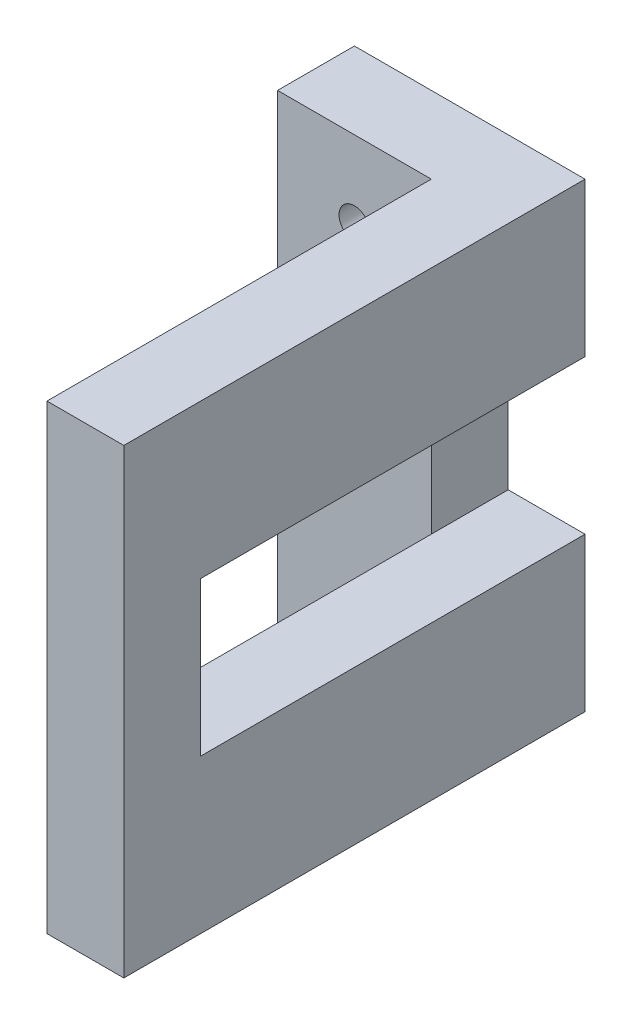
ISO-10303-21;
HEADER;
FILE_DESCRIPTION(('STEP AP214'),'2;1');
FILE_NAME('part.step','',(''),(''),'','','');
FILE_SCHEMA(('AUTOMOTIVE_DESIGN { 1 0 10303 214 1 1 1 1 }'));
ENDSEC;
DATA;
#1=APPLICATION_CONTEXT('core data for automotive mechanical design processes');
#2=APPLICATION_PROTOCOL_DEFINITION('international standard','automotive_design',2000,#1);
#3=PRODUCT_CONTEXT('',#1,'mechanical');
#4=PRODUCT('Part','Part','',(#3));
#5=PRODUCT_RELATED_PRODUCT_CATEGORY('part','',(#4));
#6=PRODUCT_DEFINITION_FORMATION('','',#4);
#7=PRODUCT_DEFINITION_CONTEXT('part definition',#1,'design');
#8=PRODUCT_DEFINITION('design','',#6,#7);
#9=PRODUCT_DEFINITION_SHAPE('','',#8);
#10=(LENGTH_UNIT() NAMED_UNIT(*) SI_UNIT(.MILLI.,.METRE.));
#11=(NAMED_UNIT(*) PLANE_ANGLE_UNIT() SI_UNIT($,.RADIAN.));
#12=(NAMED_UNIT(*) SI_UNIT($,.STERADIAN.) SOLID_ANGLE_UNIT());
#13=UNCERTAINTY_MEASURE_WITH_UNIT(LENGTH_MEASURE(1.E-05),#10,'distance_accuracy_value','');
#14=(GEOMETRIC_REPRESENTATION_CONTEXT(3) GLOBAL_UNCERTAINTY_ASSIGNED_CONTEXT((#13)) GLOBAL_UNIT_ASSIGNED_CONTEXT((#10,
#11,#12)) REPRESENTATION_CONTEXT('',''));
#15=CARTESIAN_POINT('',(0.,0.,0.));
#16=DIRECTION('',(0.,0.,1.));
#17=DIRECTION('',(1.,0.,0.));
#18=AXIS2_PLACEMENT_3D('',#15,#16,#17);
#19=CARTESIAN_POINT('',(3.0701754385965,32.280701754386,10.));
#20=DIRECTION('',(1.,0.,0.));
#21=DIRECTION('',(0.,1.,0.));
#22=AXIS2_PLACEMENT_3D('',#19,#20,#21);
#23=PLANE('',#22);
#24=DIRECTION('',(0.,-1.,0.));
#25=VECTOR('',#24,1.);
#26=CARTESIAN_POINT('',(3.0701754385965,32.280701754386,0.));
#27=LINE('',#26,#25);
#28=CARTESIAN_POINT('',(3.0701754385965,32.280701754386,0.));
#29=VERTEX_POINT('',#28);
#30=CARTESIAN_POINT('',(3.07017543859651,-27.719298245614,0.));
#31=VERTEX_POINT('',#30);
#32=EDGE_CURVE('E176',#29,#31,#27,.T.);
#33=ORIENTED_EDGE('',*,*,#32,.T.);
#34=DIRECTION('',(0.,0.,-1.));
#35=VECTOR('',#34,1.);
#36=CARTESIAN_POINT('',(3.07017543859651,-27.719298245614,10.));
#37=LINE('',#36,#35);
#38=CARTESIAN_POINT('',(3.07017543859651,-27.719298245614,10.));
#39=VERTEX_POINT('',#38);
#40=EDGE_CURVE('E11',#39,#31,#37,.T.);
#41=ORIENTED_EDGE('',*,*,#40,.F.);
#42=DIRECTION('',(0.,-1.,0.));
#43=VECTOR('',#42,1.);
#44=CARTESIAN_POINT('',(3.0701754385965,32.280701754386,10.));
#45=LINE('',#44,#43);
#46=CARTESIAN_POINT('',(3.0701754385965,32.280701754386,10.));
#47=VERTEX_POINT('',#46);
#48=EDGE_CURVE('E177',#47,#39,#45,.T.);
#49=ORIENTED_EDGE('',*,*,#48,.F.);
#50=DIRECTION('',(0.,0.,-1.));
#51=VECTOR('',#50,1.);
#52=CARTESIAN_POINT('',(3.0701754385965,32.280701754386,10.));
#53=LINE('',#52,#51);
#54=EDGE_CURVE('E186',#47,#29,#53,.T.);
#55=ORIENTED_EDGE('',*,*,#54,.T.);
#56=EDGE_LOOP('',(#33,#41,#49,#55));
#57=FACE_BOUND('',#56,.T.);
#58=ADVANCED_FACE('F37',(#57),#23,.F.);
#59=CARTESIAN_POINT('',(3.07017543859651,-27.719298245614,10.));
#60=DIRECTION('',(0.,1.,0.));
#61=DIRECTION('',(0.,0.,1.));
#62=AXIS2_PLACEMENT_3D('',#59,#60,#61);
#63=PLANE('',#62);
#64=DIRECTION('',(1.,0.,0.));
#65=VECTOR('',#64,1.);
#66=CARTESIAN_POINT('',(3.07017543859651,-27.719298245614,0.));
#67=LINE('',#66,#65);
#68=CARTESIAN_POINT('',(33.0701754385965,-27.719298245614,0.));
#69=VERTEX_POINT('',#68);
#70=EDGE_CURVE('E189',#31,#69,#67,.T.);
#71=ORIENTED_EDGE('',*,*,#70,.T.);
#72=DIRECTION('',(0.,0.,-1.));
#73=VECTOR('',#72,1.);
#74=CARTESIAN_POINT('',(33.0701754385965,-27.719298245614,10.));
#75=LINE('',#74,#73);
#76=CARTESIAN_POINT('',(33.0701754385965,-27.719298245614,60.));
#77=VERTEX_POINT('',#76);
#78=EDGE_CURVE('E45',#77,#69,#75,.T.);
#79=ORIENTED_EDGE('',*,*,#78,.F.);
#80=DIRECTION('',(1.,0.,0.));
#81=VECTOR('',#80,1.);
#82=CARTESIAN_POINT('',(33.0701754385965,-27.719298245614,60.));
#83=LINE('',#82,#81);
#84=CARTESIAN_POINT('',(23.0701754385965,-27.719298245614,60.));
#85=VERTEX_POINT('',#84);
#86=EDGE_CURVE('E163',#85,#77,#83,.T.);
#87=ORIENTED_EDGE('',*,*,#86,.F.);
#88=DIRECTION('',(0.,0.,-1.));
#89=VECTOR('',#88,1.);
#90=CARTESIAN_POINT('',(23.0701754385965,-27.719298245614,60.));
#91=LINE('',#90,#89);
#92=CARTESIAN_POINT('',(23.0701754385965,-27.719298245614,10.));
#93=VERTEX_POINT('',#92);
#94=EDGE_CURVE('E166',#85,#93,#91,.T.);
#95=ORIENTED_EDGE('',*,*,#94,.T.);
#96=DIRECTION('',(1.,0.,0.));
#97=VECTOR('',#96,1.);
#98=CARTESIAN_POINT('',(3.07017543859651,-27.719298245614,10.));
#99=LINE('',#98,#97);
#100=EDGE_CURVE('E180',#39,#93,#99,.T.);
#101=ORIENTED_EDGE('',*,*,#100,.F.);
#102=ORIENTED_EDGE('',*,*,#40,.T.);
#103=EDGE_LOOP('',(#71,#79,#87,#95,#101,#102));
#104=FACE_BOUND('',#103,.T.);
#105=ADVANCED_FACE('F224',(#104),#63,.F.);
#106=CARTESIAN_POINT('',(33.0701754385965,32.280701754386,10.));
#107=DIRECTION('',(-1.,0.,0.));
#108=DIRECTION('',(0.,0.,1.));
#109=AXIS2_PLACEMENT_3D('',#106,#107,#108);
#110=PLANE('',#109);
#111=DIRECTION('',(0.,-1.,0.));
#112=VECTOR('',#111,1.);
#113=CARTESIAN_POINT('',(33.0701754385965,12.280701754386,50.));
#114=LINE('',#113,#112);
#115=CARTESIAN_POINT('',(33.0701754385965,12.280701754386,50.));
#116=VERTEX_POINT('',#115);
#117=CARTESIAN_POINT('',(33.0701754385965,-7.71929824561404,50.));
#118=VERTEX_POINT('',#117);
#119=EDGE_CURVE('E125',#116,#118,#114,.T.);
#120=ORIENTED_EDGE('',*,*,#119,.F.);
#121=DIRECTION('',(0.,0.,-1.));
#122=VECTOR('',#121,1.);
#123=CARTESIAN_POINT('',(33.0701754385965,12.280701754386,50.));
#124=LINE('',#123,#122);
#125=CARTESIAN_POINT('',(33.0701754385965,12.280701754386,0.));
#126=VERTEX_POINT('',#125);
#127=EDGE_CURVE('E154',#116,#126,#124,.T.);
#128=ORIENTED_EDGE('',*,*,#127,.T.);
#129=DIRECTION('',(0.,1.,0.));
#130=VECTOR('',#129,1.);
#131=CARTESIAN_POINT('',(33.0701754385965,32.280701754386,0.));
#132=LINE('',#131,#130);
#133=CARTESIAN_POINT('',(33.0701754385965,32.280701754386,0.));
#134=VERTEX_POINT('',#133);
#135=EDGE_CURVE('E191',#126,#134,#132,.T.);
#136=ORIENTED_EDGE('',*,*,#135,.T.);
#137=DIRECTION('',(0.,0.,-1.));
#138=VECTOR('',#137,1.);
#139=CARTESIAN_POINT('',(33.0701754385965,32.280701754386,10.));
#140=LINE('',#139,#138);
#141=CARTESIAN_POINT('',(33.0701754385965,32.280701754386,60.));
#142=VERTEX_POINT('',#141);
#143=EDGE_CURVE('E196',#142,#134,#140,.T.);
#144=ORIENTED_EDGE('',*,*,#143,.F.);
#145=DIRECTION('',(0.,1.,0.));
#146=VECTOR('',#145,1.);
#147=CARTESIAN_POINT('',(33.0701754385965,32.280701754386,60.));
#148=LINE('',#147,#146);
#149=EDGE_CURVE('E155',#77,#142,#148,.T.);
#150=ORIENTED_EDGE('',*,*,#149,.F.);
#151=ORIENTED_EDGE('',*,*,#78,.T.);
#152=CARTESIAN_POINT('',(33.0701754385965,-7.71929824561404,0.));
#153=VERTEX_POINT('',#152);
#154=EDGE_CURVE('E140',#69,#153,#132,.T.);
#155=ORIENTED_EDGE('',*,*,#154,.T.);
#156=DIRECTION('',(0.,0.,-1.));
#157=VECTOR('',#156,1.);
#158=CARTESIAN_POINT('',(33.0701754385965,-7.71929824561404,50.));
#159=LINE('',#158,#157);
#160=EDGE_CURVE('E53',#118,#153,#159,.T.);
#161=ORIENTED_EDGE('',*,*,#160,.F.);
#162=EDGE_LOOP('',(#120,#128,#136,#144,#150,#151,#155,#161));
#163=FACE_BOUND('',#162,.T.);
#164=ADVANCED_FACE('F137',(#163),#110,.F.);
#165=CARTESIAN_POINT('',(3.0701754385965,32.280701754386,10.));
#166=DIRECTION('',(0.,-1.,0.));
#167=DIRECTION('',(0.,0.,-1.));
#168=AXIS2_PLACEMENT_3D('',#165,#166,#167);
#169=PLANE('',#168);
#170=DIRECTION('',(-1.,0.,0.));
#171=VECTOR('',#170,1.);
#172=CARTESIAN_POINT('',(3.0701754385965,32.280701754386,0.));
#173=LINE('',#172,#171);
#174=EDGE_CURVE('E181',#134,#29,#173,.T.);
#175=ORIENTED_EDGE('',*,*,#174,.T.);
#176=ORIENTED_EDGE('',*,*,#54,.F.);
#177=DIRECTION('',(-1.,0.,0.));
#178=VECTOR('',#177,1.);
#179=CARTESIAN_POINT('',(3.0701754385965,32.280701754386,10.));
#180=LINE('',#179,#178);
#181=CARTESIAN_POINT('',(23.0701754385965,32.280701754386,10.));
#182=VERTEX_POINT('',#181);
#183=EDGE_CURVE('E184',#182,#47,#180,.T.);
#184=ORIENTED_EDGE('',*,*,#183,.F.);
#185=DIRECTION('',(0.,0.,-1.));
#186=VECTOR('',#185,1.);
#187=CARTESIAN_POINT('',(23.0701754385965,32.280701754386,60.));
#188=LINE('',#187,#186);
#189=CARTESIAN_POINT('',(23.0701754385965,32.280701754386,60.));
#190=VERTEX_POINT('',#189);
#191=EDGE_CURVE('E173',#190,#182,#188,.T.);
#192=ORIENTED_EDGE('',*,*,#191,.F.);
#193=DIRECTION('',(-1.,0.,0.));
#194=VECTOR('',#193,1.);
#195=CARTESIAN_POINT('',(33.0701754385965,32.280701754386,60.));
#196=LINE('',#195,#194);
#197=EDGE_CURVE('E158',#142,#190,#196,.T.);
#198=ORIENTED_EDGE('',*,*,#197,.F.);
#199=ORIENTED_EDGE('',*,*,#143,.T.);
#200=EDGE_LOOP('',(#175,#176,#184,#192,#198,#199));
#201=FACE_BOUND('',#200,.T.);
#202=ADVANCED_FACE('F233',(#201),#169,.F.);
#203=CARTESIAN_POINT('',(0.,0.,10.));
#204=DIRECTION('',(0.,0.,1.));
#205=DIRECTION('',(1.,0.,0.));
#206=AXIS2_PLACEMENT_3D('',#203,#204,#205);
#207=PLANE('',#206);
#208=CARTESIAN_POINT('',(13.0701754385965,22.280701754386,10.));
#209=DIRECTION('',(0.,0.,1.));
#210=DIRECTION('',(1.,0.,0.));
#211=AXIS2_PLACEMENT_3D('',#208,#209,#210);
#212=CIRCLE('',#211,2.);
#213=CARTESIAN_POINT('',(15.0701754385965,22.280701754386,10.));
#214=VERTEX_POINT('',#213);
#215=EDGE_CURVE('E147',#214,#214,#212,.T.);
#216=ORIENTED_EDGE('',*,*,#215,.F.);
#217=EDGE_LOOP('',(#216));
#218=FACE_BOUND('',#217,.T.);
#219=CARTESIAN_POINT('',(13.0701754385965,2.28070175438596,10.));
#220=DIRECTION('',(0.,0.,1.));
#221=DIRECTION('',(1.,0.,0.));
#222=AXIS2_PLACEMENT_3D('',#219,#220,#221);
#223=CIRCLE('',#222,2.);
#224=CARTESIAN_POINT('',(15.0701754385965,2.28070175438596,10.));
#225=VERTEX_POINT('',#224);
#226=EDGE_CURVE('E151',#225,#225,#223,.T.);
#227=ORIENTED_EDGE('',*,*,#226,.F.);
#228=EDGE_LOOP('',(#227));
#229=FACE_BOUND('',#228,.T.);
#230=DIRECTION('',(0.,-1.,0.));
#231=VECTOR('',#230,1.);
#232=CARTESIAN_POINT('',(23.0701754385965,32.280701754386,10.));
#233=LINE('',#232,#231);
#234=CARTESIAN_POINT('',(23.0701754385965,12.280701754386,10.));
#235=VERTEX_POINT('',#234);
#236=EDGE_CURVE('E159',#182,#235,#233,.T.);
#237=ORIENTED_EDGE('',*,*,#236,.F.);
#238=ORIENTED_EDGE('',*,*,#183,.T.);
#239=ORIENTED_EDGE('',*,*,#48,.T.);
#240=ORIENTED_EDGE('',*,*,#100,.T.);
#241=CARTESIAN_POINT('',(23.0701754385965,-7.71929824561404,10.));
#242=VERTEX_POINT('',#241);
#243=EDGE_CURVE('E170',#242,#93,#233,.T.);
#244=ORIENTED_EDGE('',*,*,#243,.F.);
#245=EDGE_CURVE('E169',#235,#242,#233,.T.);
#246=ORIENTED_EDGE('',*,*,#245,.F.);
#247=EDGE_LOOP('',(#237,#238,#239,#240,#244,#246));
#248=FACE_BOUND('',#247,.T.);
#249=ADVANCED_FACE('F219',(#218,#229,#248),#207,.T.);
#250=CARTESIAN_POINT('',(0.,0.,0.));
#251=DIRECTION('',(0.,0.,1.));
#252=DIRECTION('',(1.,0.,0.));
#253=AXIS2_PLACEMENT_3D('',#250,#251,#252);
#254=PLANE('',#253);
#255=CARTESIAN_POINT('',(13.0701754385965,22.280701754386,0.));
#256=DIRECTION('',(0.,0.,1.));
#257=DIRECTION('',(1.,0.,0.));
#258=AXIS2_PLACEMENT_3D('',#255,#256,#257);
#259=CIRCLE('',#258,2.);
#260=CARTESIAN_POINT('',(15.0701754385965,22.280701754386,0.));
#261=VERTEX_POINT('',#260);
#262=EDGE_CURVE('E40',#261,#261,#259,.T.);
#263=ORIENTED_EDGE('',*,*,#262,.T.);
#264=EDGE_LOOP('',(#263));
#265=FACE_BOUND('',#264,.T.);
#266=CARTESIAN_POINT('',(13.0701754385965,2.28070175438596,0.));
#267=DIRECTION('',(0.,0.,1.));
#268=DIRECTION('',(1.,0.,0.));
#269=AXIS2_PLACEMENT_3D('',#266,#267,#268);
#270=CIRCLE('',#269,2.);
#271=CARTESIAN_POINT('',(15.0701754385965,2.28070175438596,0.));
#272=VERTEX_POINT('',#271);
#273=EDGE_CURVE('E150',#272,#272,#270,.T.);
#274=ORIENTED_EDGE('',*,*,#273,.T.);
#275=EDGE_LOOP('',(#274));
#276=FACE_BOUND('',#275,.T.);
#277=ORIENTED_EDGE('',*,*,#135,.F.);
#278=DIRECTION('',(1.,0.,0.));
#279=VECTOR('',#278,1.);
#280=CARTESIAN_POINT('',(33.0701754385965,12.280701754386,0.));
#281=LINE('',#280,#279);
#282=CARTESIAN_POINT('',(23.0701754385965,12.280701754386,0.));
#283=VERTEX_POINT('',#282);
#284=EDGE_CURVE('E134',#283,#126,#281,.T.);
#285=ORIENTED_EDGE('',*,*,#284,.F.);
#286=DIRECTION('',(0.,1.,0.));
#287=VECTOR('',#286,1.);
#288=CARTESIAN_POINT('',(23.0701754385965,12.280701754386,0.));
#289=LINE('',#288,#287);
#290=CARTESIAN_POINT('',(23.0701754385965,-7.71929824561404,0.));
#291=VERTEX_POINT('',#290);
#292=EDGE_CURVE('E240',#291,#283,#289,.T.);
#293=ORIENTED_EDGE('',*,*,#292,.F.);
#294=DIRECTION('',(-1.,0.,0.));
#295=VECTOR('',#294,1.);
#296=CARTESIAN_POINT('',(33.0701754385965,-7.71929824561404,0.));
#297=LINE('',#296,#295);
#298=EDGE_CURVE('E215',#153,#291,#297,.T.);
#299=ORIENTED_EDGE('',*,*,#298,.F.);
#300=ORIENTED_EDGE('',*,*,#154,.F.);
#301=ORIENTED_EDGE('',*,*,#70,.F.);
#302=ORIENTED_EDGE('',*,*,#32,.F.);
#303=ORIENTED_EDGE('',*,*,#174,.F.);
#304=EDGE_LOOP('',(#277,#285,#293,#299,#300,#301,#302,#303));
#305=FACE_BOUND('',#304,.T.);
#306=ADVANCED_FACE('F248',(#265,#276,#305),#254,.F.);
#307=CARTESIAN_POINT('',(23.0701754385965,32.280701754386,60.));
#308=DIRECTION('',(1.,0.,0.));
#309=DIRECTION('',(0.,1.,0.));
#310=AXIS2_PLACEMENT_3D('',#307,#308,#309);
#311=PLANE('',#310);
#312=ORIENTED_EDGE('',*,*,#236,.T.);
#313=DIRECTION('',(0.,0.,-1.));
#314=VECTOR('',#313,1.);
#315=CARTESIAN_POINT('',(23.0701754385965,12.280701754386,50.));
#316=LINE('',#315,#314);
#317=CARTESIAN_POINT('',(23.0701754385965,12.280701754386,50.));
#318=VERTEX_POINT('',#317);
#319=EDGE_CURVE('E235',#318,#235,#316,.T.);
#320=ORIENTED_EDGE('',*,*,#319,.F.);
#321=DIRECTION('',(0.,1.,0.));
#322=VECTOR('',#321,1.);
#323=CARTESIAN_POINT('',(23.0701754385965,12.280701754386,50.));
#324=LINE('',#323,#322);
#325=CARTESIAN_POINT('',(23.0701754385965,-7.71929824561404,50.));
#326=VERTEX_POINT('',#325);
#327=EDGE_CURVE('E124',#326,#318,#324,.T.);
#328=ORIENTED_EDGE('',*,*,#327,.F.);
#329=DIRECTION('',(0.,0.,-1.));
#330=VECTOR('',#329,1.);
#331=CARTESIAN_POINT('',(23.0701754385965,-7.71929824561404,50.));
#332=LINE('',#331,#330);
#333=EDGE_CURVE('E122',#326,#242,#332,.T.);
#334=ORIENTED_EDGE('',*,*,#333,.T.);
#335=ORIENTED_EDGE('',*,*,#243,.T.);
#336=ORIENTED_EDGE('',*,*,#94,.F.);
#337=DIRECTION('',(0.,-1.,0.));
#338=VECTOR('',#337,1.);
#339=CARTESIAN_POINT('',(23.0701754385965,32.280701754386,60.));
#340=LINE('',#339,#338);
#341=EDGE_CURVE('E161',#190,#85,#340,.T.);
#342=ORIENTED_EDGE('',*,*,#341,.F.);
#343=ORIENTED_EDGE('',*,*,#191,.T.);
#344=EDGE_LOOP('',(#312,#320,#328,#334,#335,#336,#342,#343));
#345=FACE_BOUND('',#344,.T.);
#346=ADVANCED_FACE('F217',(#345),#311,.F.);
#347=CARTESIAN_POINT('',(0.,0.,60.));
#348=DIRECTION('',(0.,0.,-1.));
#349=DIRECTION('',(-1.,0.,0.));
#350=AXIS2_PLACEMENT_3D('',#347,#348,#349);
#351=PLANE('',#350);
#352=ORIENTED_EDGE('',*,*,#149,.T.);
#353=ORIENTED_EDGE('',*,*,#197,.T.);
#354=ORIENTED_EDGE('',*,*,#341,.T.);
#355=ORIENTED_EDGE('',*,*,#86,.T.);
#356=EDGE_LOOP('',(#352,#353,#354,#355));
#357=FACE_BOUND('',#356,.T.);
#358=ADVANCED_FACE('F228',(#357),#351,.F.);
#359=CARTESIAN_POINT('',(13.0701754385965,2.28070175438596,-40.));
#360=DIRECTION('',(0.,0.,1.));
#361=DIRECTION('',(1.,0.,0.));
#362=AXIS2_PLACEMENT_3D('',#359,#360,#361);
#363=CYLINDRICAL_SURFACE('',#362,2.);
#364=ORIENTED_EDGE('',*,*,#226,.T.);
#365=EDGE_LOOP('',(#364));
#366=FACE_BOUND('',#365,.T.);
#367=ORIENTED_EDGE('',*,*,#273,.F.);
#368=EDGE_LOOP('',(#367));
#369=FACE_BOUND('',#368,.T.);
#370=ADVANCED_FACE('F271',(#366,#369),#363,.F.);
#371=CARTESIAN_POINT('',(13.0701754385965,22.280701754386,-40.));
#372=DIRECTION('',(0.,0.,1.));
#373=DIRECTION('',(1.,0.,0.));
#374=AXIS2_PLACEMENT_3D('',#371,#372,#373);
#375=CYLINDRICAL_SURFACE('',#374,2.);
#376=ORIENTED_EDGE('',*,*,#215,.T.);
#377=EDGE_LOOP('',(#376));
#378=FACE_BOUND('',#377,.T.);
#379=ORIENTED_EDGE('',*,*,#262,.F.);
#380=EDGE_LOOP('',(#379));
#381=FACE_BOUND('',#380,.T.);
#382=ADVANCED_FACE('F274',(#378,#381),#375,.F.);
#383=CARTESIAN_POINT('',(33.0701754385965,12.280701754386,50.));
#384=DIRECTION('',(0.,1.,0.));
#385=DIRECTION('',(0.,0.,1.));
#386=AXIS2_PLACEMENT_3D('',#383,#384,#385);
#387=PLANE('',#386);
#388=ORIENTED_EDGE('',*,*,#284,.T.);
#389=ORIENTED_EDGE('',*,*,#127,.F.);
#390=DIRECTION('',(1.,0.,0.));
#391=VECTOR('',#390,1.);
#392=CARTESIAN_POINT('',(33.0701754385965,12.280701754386,50.));
#393=LINE('',#392,#391);
#394=EDGE_CURVE('E131',#318,#116,#393,.T.);
#395=ORIENTED_EDGE('',*,*,#394,.F.);
#396=ORIENTED_EDGE('',*,*,#319,.T.);
#397=EDGE_CURVE('E212',#235,#283,#316,.T.);
#398=ORIENTED_EDGE('',*,*,#397,.T.);
#399=EDGE_LOOP('',(#388,#389,#395,#396,#398));
#400=FACE_BOUND('',#399,.T.);
#401=ADVANCED_FACE('F243',(#400),#387,.F.);
#402=CARTESIAN_POINT('',(23.0701754385965,12.280701754386,50.));
#403=DIRECTION('',(-1.,0.,0.));
#404=DIRECTION('',(0.,0.,1.));
#405=AXIS2_PLACEMENT_3D('',#402,#403,#404);
#406=PLANE('',#405);
#407=ORIENTED_EDGE('',*,*,#245,.T.);
#408=EDGE_CURVE('E141',#242,#291,#332,.T.);
#409=ORIENTED_EDGE('',*,*,#408,.T.);
#410=ORIENTED_EDGE('',*,*,#292,.T.);
#411=ORIENTED_EDGE('',*,*,#397,.F.);
#412=EDGE_LOOP('',(#407,#409,#410,#411));
#413=FACE_BOUND('',#412,.T.);
#414=ADVANCED_FACE('F210',(#413),#406,.F.);
#415=CARTESIAN_POINT('',(33.0701754385965,-7.71929824561404,50.));
#416=DIRECTION('',(0.,-1.,0.));
#417=DIRECTION('',(0.,0.,-1.));
#418=AXIS2_PLACEMENT_3D('',#415,#416,#417);
#419=PLANE('',#418);
#420=ORIENTED_EDGE('',*,*,#298,.T.);
#421=ORIENTED_EDGE('',*,*,#408,.F.);
#422=ORIENTED_EDGE('',*,*,#333,.F.);
#423=DIRECTION('',(-1.,0.,0.));
#424=VECTOR('',#423,1.);
#425=CARTESIAN_POINT('',(33.0701754385965,-7.71929824561404,50.));
#426=LINE('',#425,#424);
#427=EDGE_CURVE('E60',#118,#326,#426,.T.);
#428=ORIENTED_EDGE('',*,*,#427,.F.);
#429=ORIENTED_EDGE('',*,*,#160,.T.);
#430=EDGE_LOOP('',(#420,#421,#422,#428,#429));
#431=FACE_BOUND('',#430,.T.);
#432=ADVANCED_FACE('F119',(#431),#419,.F.);
#433=CARTESIAN_POINT('',(0.,0.,50.));
#434=DIRECTION('',(0.,0.,-1.));
#435=DIRECTION('',(-1.,0.,0.));
#436=AXIS2_PLACEMENT_3D('',#433,#434,#435);
#437=PLANE('',#436);
#438=ORIENTED_EDGE('',*,*,#119,.T.);
#439=ORIENTED_EDGE('',*,*,#427,.T.);
#440=ORIENTED_EDGE('',*,*,#327,.T.);
#441=ORIENTED_EDGE('',*,*,#394,.T.);
#442=EDGE_LOOP('',(#438,#439,#440,#441));
#443=FACE_BOUND('',#442,.T.);
#444=ADVANCED_FACE('F129',(#443),#437,.T.);
#445=CLOSED_SHELL('',(#58,#105,#164,#202,#249,#306,#346,#358,#370,#382,#401,#414,#432,#444));
#446=MANIFOLD_SOLID_BREP('B2',#445);
#447=ADVANCED_BREP_SHAPE_REPRESENTATION('',(#18,#446),#14);
#448=SHAPE_DEFINITION_REPRESENTATION(#9,#447);
ENDSEC;
END-ISO-10303-21;
